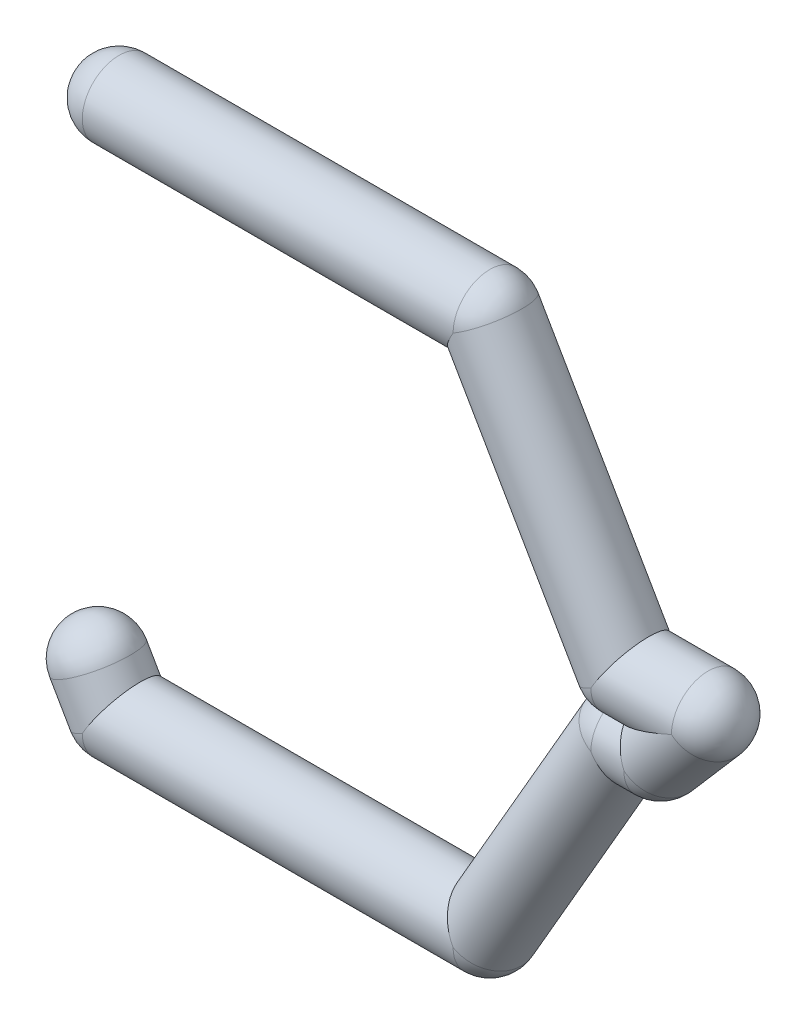
ISO-10303-21;
HEADER;
FILE_DESCRIPTION(('STEP AP214'),'2;1');
FILE_NAME('part.step','',(''),(''),'','','');
FILE_SCHEMA(('AUTOMOTIVE_DESIGN { 1 0 10303 214 1 1 1 1 }'));
ENDSEC;
DATA;
#1=APPLICATION_CONTEXT('core data for automotive mechanical design processes');
#2=APPLICATION_PROTOCOL_DEFINITION('international standard','automotive_design',2000,#1);
#3=PRODUCT_CONTEXT('',#1,'mechanical');
#4=PRODUCT('Part','Part','',(#3));
#5=PRODUCT_RELATED_PRODUCT_CATEGORY('part','',(#4));
#6=PRODUCT_DEFINITION_FORMATION('','',#4);
#7=PRODUCT_DEFINITION_CONTEXT('part definition',#1,'design');
#8=PRODUCT_DEFINITION('design','',#6,#7);
#9=PRODUCT_DEFINITION_SHAPE('','',#8);
#10=(LENGTH_UNIT() NAMED_UNIT(*) SI_UNIT(.MILLI.,.METRE.));
#11=(NAMED_UNIT(*) PLANE_ANGLE_UNIT() SI_UNIT($,.RADIAN.));
#12=(NAMED_UNIT(*) SI_UNIT($,.STERADIAN.) SOLID_ANGLE_UNIT());
#13=UNCERTAINTY_MEASURE_WITH_UNIT(LENGTH_MEASURE(1.E-05),#10,'distance_accuracy_value','');
#14=(GEOMETRIC_REPRESENTATION_CONTEXT(3) GLOBAL_UNCERTAINTY_ASSIGNED_CONTEXT((#13)) GLOBAL_UNIT_ASSIGNED_CONTEXT((#10,
#11,#12)) REPRESENTATION_CONTEXT('',''));
#15=CARTESIAN_POINT('',(0.,0.,0.));
#16=DIRECTION('',(0.,0.,1.));
#17=DIRECTION('',(1.,0.,0.));
#18=AXIS2_PLACEMENT_3D('',#15,#16,#17);
#19=CARTESIAN_POINT('',(-14.515,-13.08,1.425));
#20=DIRECTION('',(1.,0.,0.));
#21=DIRECTION('',(0.,-1.,0.));
#22=AXIS2_PLACEMENT_3D('',#19,#20,#21);
#23=SPHERICAL_SURFACE('',#22,0.24);
#24=CARTESIAN_POINT('',(-14.515,-13.08,1.425));
#25=DIRECTION('',(-0.500460168825931,0.865759562129533,0.));
#26=DIRECTION('',(-0.865759562129533,-0.500460168825931,0.));
#27=AXIS2_PLACEMENT_3D('',#24,#25,#26);
#28=CIRCLE('',#27,0.239999999999999);
#29=CARTESIAN_POINT('',(-14.515,-13.08,1.185));
#30=VERTEX_POINT('',#29);
#31=CARTESIAN_POINT('',(-14.515,-13.08,1.665));
#32=VERTEX_POINT('',#31);
#33=EDGE_CURVE('E150',#30,#32,#28,.T.);
#34=ORIENTED_EDGE('',*,*,#33,.F.);
#35=CARTESIAN_POINT('',(-14.515,-13.08,1.425));
#36=DIRECTION('',(-1.,0.,0.));
#37=DIRECTION('',(0.,0.,1.));
#38=AXIS2_PLACEMENT_3D('',#35,#36,#37);
#39=CIRCLE('',#38,0.24);
#40=EDGE_CURVE('E151',#32,#30,#39,.F.);
#41=ORIENTED_EDGE('',*,*,#40,.F.);
#42=EDGE_LOOP('',(#34,#41));
#43=FACE_BOUND('',#42,.T.);
#44=ADVANCED_FACE('F81',(#43),#23,.T.);
#45=CARTESIAN_POINT('',(-12.09,-13.08,1.425));
#46=DIRECTION('',(-1.,0.,0.));
#47=DIRECTION('',(0.,0.,1.));
#48=AXIS2_PLACEMENT_3D('',#45,#46,#47);
#49=CYLINDRICAL_SURFACE('',#48,0.24);
#50=CARTESIAN_POINT('',(-14.515,-13.08,1.425));
#51=DIRECTION('',(-0.86615823289568,0.499769862623822,0.));
#52=DIRECTION('',(-0.499769862623821,-0.86615823289568,0.));
#53=AXIS2_PLACEMENT_3D('',#50,#51,#52);
#54=ELLIPSE('',#53,0.277085630413797,0.24);
#55=EDGE_CURVE('E94',#32,#30,#54,.T.);
#56=ORIENTED_EDGE('',*,*,#55,.F.);
#57=ORIENTED_EDGE('',*,*,#40,.T.);
#58=EDGE_LOOP('',(#56,#57));
#59=FACE_BOUND('',#58,.T.);
#60=CARTESIAN_POINT('',(-12.09,-13.08,1.425));
#61=DIRECTION('',(-0.866065491045954,-0.499930560397472,0.));
#62=DIRECTION('',(-0.499930560397472,0.866065491045954,0.));
#63=AXIS2_PLACEMENT_3D('',#60,#61,#62);
#64=ELLIPSE('',#63,0.277115301881097,0.24);
#65=CARTESIAN_POINT('',(-12.09,-13.08,1.185));
#66=VERTEX_POINT('',#65);
#67=CARTESIAN_POINT('',(-12.09,-13.08,1.665));
#68=VERTEX_POINT('',#67);
#69=EDGE_CURVE('E88',#66,#68,#64,.F.);
#70=ORIENTED_EDGE('',*,*,#69,.F.);
#71=CARTESIAN_POINT('',(-12.09,-13.08,1.425));
#72=DIRECTION('',(-1.,0.,0.));
#73=DIRECTION('',(0.,0.,1.));
#74=AXIS2_PLACEMENT_3D('',#71,#72,#73);
#75=CIRCLE('',#74,0.24);
#76=EDGE_CURVE('E155',#66,#68,#75,.T.);
#77=ORIENTED_EDGE('',*,*,#76,.T.);
#78=EDGE_LOOP('',(#70,#77));
#79=FACE_BOUND('',#78,.T.);
#80=ADVANCED_FACE('F154',(#59,#79),#49,.T.);
#81=CARTESIAN_POINT('',(-12.09,-13.08,1.425));
#82=DIRECTION('',(1.,0.,0.));
#83=DIRECTION('',(0.,-1.,0.));
#84=AXIS2_PLACEMENT_3D('',#81,#82,#83);
#85=SPHERICAL_SURFACE('',#84,0.24);
#86=ORIENTED_EDGE('',*,*,#76,.F.);
#87=CARTESIAN_POINT('',(-12.09,-13.08,1.425));
#88=DIRECTION('',(-0.500138869561338,-0.865945212559032,0.));
#89=DIRECTION('',(0.865945212559032,-0.500138869561338,0.));
#90=AXIS2_PLACEMENT_3D('',#87,#88,#89);
#91=CIRCLE('',#90,0.24);
#92=EDGE_CURVE('E214',#68,#66,#91,.F.);
#93=ORIENTED_EDGE('',*,*,#92,.F.);
#94=EDGE_LOOP('',(#86,#93));
#95=FACE_BOUND('',#94,.T.);
#96=ADVANCED_FACE('F224',(#95),#85,.T.);
#97=CARTESIAN_POINT('',(-11.189,-11.52,1.425));
#98=DIRECTION('',(-0.500138869561338,-0.865945212559032,0.));
#99=DIRECTION('',(0.865945212559032,-0.500138869561338,0.));
#100=AXIS2_PLACEMENT_3D('',#97,#98,#99);
#101=CYLINDRICAL_SURFACE('',#100,0.240000000000001);
#102=CARTESIAN_POINT('',(-11.189,-11.52,1.425));
#103=DIRECTION('',(-0.866065491045954,-0.499930560397472,0.));
#104=DIRECTION('',(0.499930560397472,-0.866065491045954,0.));
#105=AXIS2_PLACEMENT_3D('',#102,#103,#104);
#106=ELLIPSE('',#105,0.277115301881097,0.24);
#107=CARTESIAN_POINT('',(-11.189,-11.52,1.665));
#108=VERTEX_POINT('',#107);
#109=CARTESIAN_POINT('',(-11.189,-11.52,1.185));
#110=VERTEX_POINT('',#109);
#111=EDGE_CURVE('E217',#108,#110,#106,.F.);
#112=ORIENTED_EDGE('',*,*,#111,.F.);
#113=CARTESIAN_POINT('',(-11.189,-11.52,1.425));
#114=DIRECTION('',(-0.500138869561336,-0.865945212559033,0.));
#115=DIRECTION('',(0.865945212559033,-0.500138869561336,0.));
#116=AXIS2_PLACEMENT_3D('',#113,#114,#115);
#117=CIRCLE('',#116,0.240000000000001);
#118=EDGE_CURVE('E212',#108,#110,#117,.T.);
#119=ORIENTED_EDGE('',*,*,#118,.T.);
#120=EDGE_LOOP('',(#112,#119));
#121=FACE_BOUND('',#120,.T.);
#122=ORIENTED_EDGE('',*,*,#92,.T.);
#123=ORIENTED_EDGE('',*,*,#69,.T.);
#124=EDGE_LOOP('',(#122,#123));
#125=FACE_BOUND('',#124,.T.);
#126=ADVANCED_FACE('F222',(#121,#125),#101,.T.);
#127=CARTESIAN_POINT('',(-11.189,-11.52,1.425));
#128=DIRECTION('',(1.,0.,0.));
#129=DIRECTION('',(0.,-1.,0.));
#130=AXIS2_PLACEMENT_3D('',#127,#128,#129);
#131=SPHERICAL_SURFACE('',#130,0.24);
#132=ORIENTED_EDGE('',*,*,#118,.F.);
#133=CARTESIAN_POINT('',(-11.189,-11.52,1.425));
#134=DIRECTION('',(-1.,0.,0.));
#135=DIRECTION('',(0.,0.,1.));
#136=AXIS2_PLACEMENT_3D('',#133,#134,#135);
#137=CIRCLE('',#136,0.24);
#138=CARTESIAN_POINT('',(-11.189,-11.34,1.58374507866388));
#139=VERTEX_POINT('',#138);
#140=EDGE_CURVE('E161',#108,#139,#137,.T.);
#141=ORIENTED_EDGE('',*,*,#140,.T.);
#142=CARTESIAN_POINT('',(-11.189,-11.34,1.425));
#143=DIRECTION('',(0.,-1.,0.));
#144=DIRECTION('',(0.,0.,-1.));
#145=AXIS2_PLACEMENT_3D('',#142,#143,#144);
#146=CIRCLE('',#145,0.158745078663876);
#147=CARTESIAN_POINT('',(-11.189,-11.34,1.26625492133612));
#148=VERTEX_POINT('',#147);
#149=EDGE_CURVE('E187',#139,#148,#146,.T.);
#150=ORIENTED_EDGE('',*,*,#149,.T.);
#151=EDGE_CURVE('E164',#148,#110,#137,.T.);
#152=ORIENTED_EDGE('',*,*,#151,.T.);
#153=EDGE_LOOP('',(#132,#141,#150,#152));
#154=FACE_BOUND('',#153,.T.);
#155=ADVANCED_FACE('F238',(#154),#131,.T.);
#156=CARTESIAN_POINT('',(-10.973,-11.52,1.425));
#157=DIRECTION('',(1.,0.,0.));
#158=DIRECTION('',(0.,-1.,0.));
#159=AXIS2_PLACEMENT_3D('',#156,#157,#158);
#160=SPHERICAL_SURFACE('',#159,0.24);
#161=CARTESIAN_POINT('',(-10.973,-11.52,1.425));
#162=DIRECTION('',(-0.65372931799024,-0.756728470985475,0.));
#163=DIRECTION('',(0.756728470985475,-0.65372931799024,0.));
#164=AXIS2_PLACEMENT_3D('',#161,#162,#163);
#165=CIRCLE('',#164,0.240000000000001);
#166=CARTESIAN_POINT('',(-10.973,-11.52,1.185));
#167=VERTEX_POINT('',#166);
#168=CARTESIAN_POINT('',(-10.973,-11.52,1.665));
#169=VERTEX_POINT('',#168);
#170=EDGE_CURVE('E176',#167,#169,#165,.T.);
#171=ORIENTED_EDGE('',*,*,#170,.T.);
#172=CARTESIAN_POINT('',(-10.973,-11.52,1.425));
#173=DIRECTION('',(-1.,0.,0.));
#174=DIRECTION('',(0.,0.,1.));
#175=AXIS2_PLACEMENT_3D('',#172,#173,#174);
#176=CIRCLE('',#175,0.24);
#177=EDGE_CURVE('E158',#167,#169,#176,.T.);
#178=ORIENTED_EDGE('',*,*,#177,.F.);
#179=EDGE_LOOP('',(#171,#178));
#180=FACE_BOUND('',#179,.T.);
#181=ADVANCED_FACE('F244',(#180),#160,.T.);
#182=CARTESIAN_POINT('',(-10.662,-11.16,1.425));
#183=DIRECTION('',(1.,0.,0.));
#184=DIRECTION('',(0.,-1.,0.));
#185=AXIS2_PLACEMENT_3D('',#182,#183,#184);
#186=SPHERICAL_SURFACE('',#185,0.24);
#187=CARTESIAN_POINT('',(-10.662,-11.16,1.425));
#188=DIRECTION('',(-0.65372931799024,-0.756728470985475,0.));
#189=DIRECTION('',(0.756728470985475,-0.65372931799024,0.));
#190=AXIS2_PLACEMENT_3D('',#187,#188,#189);
#191=CIRCLE('',#190,0.240000000000001);
#192=CARTESIAN_POINT('',(-10.662,-11.16,1.185));
#193=VERTEX_POINT('',#192);
#194=CARTESIAN_POINT('',(-10.662,-11.16,1.665));
#195=VERTEX_POINT('',#194);
#196=EDGE_CURVE('E173',#193,#195,#191,.T.);
#197=ORIENTED_EDGE('',*,*,#196,.F.);
#198=CARTESIAN_POINT('',(-10.662,-11.16,1.425));
#199=DIRECTION('',(1.,0.,0.));
#200=DIRECTION('',(0.,0.,-1.));
#201=AXIS2_PLACEMENT_3D('',#198,#199,#200);
#202=CIRCLE('',#201,0.24);
#203=EDGE_CURVE('E202',#195,#193,#202,.F.);
#204=ORIENTED_EDGE('',*,*,#203,.F.);
#205=EDGE_LOOP('',(#197,#204));
#206=FACE_BOUND('',#205,.T.);
#207=ADVANCED_FACE('F240',(#206),#186,.T.);
#208=CARTESIAN_POINT('',(-11.189,-11.16,1.425));
#209=DIRECTION('',(1.,0.,0.));
#210=DIRECTION('',(0.,0.,-1.));
#211=AXIS2_PLACEMENT_3D('',#208,#209,#210);
#212=CYLINDRICAL_SURFACE('',#211,0.24);
#213=DIRECTION('',(-1.,0.,0.));
#214=VECTOR('',#213,1.);
#215=CARTESIAN_POINT('',(-11.081,-11.34,1.26625492133612));
#216=LINE('',#215,#214);
#217=CARTESIAN_POINT('',(-11.0553660337249,-11.34,1.26625492133612));
#218=VERTEX_POINT('',#217);
#219=EDGE_CURVE('E167',#148,#218,#216,.F.);
#220=ORIENTED_EDGE('',*,*,#219,.F.);
#221=CARTESIAN_POINT('',(-11.189,-11.16,1.425));
#222=DIRECTION('',(1.,0.,0.));
#223=DIRECTION('',(0.,0.,-1.));
#224=AXIS2_PLACEMENT_3D('',#221,#222,#223);
#225=CIRCLE('',#224,0.24);
#226=CARTESIAN_POINT('',(-11.189,-11.16,1.185));
#227=VERTEX_POINT('',#226);
#228=EDGE_CURVE('E199',#148,#227,#225,.T.);
#229=ORIENTED_EDGE('',*,*,#228,.T.);
#230=CARTESIAN_POINT('',(-11.189,-11.16,1.425));
#231=DIRECTION('',(0.866065491045954,-0.499930560397472,0.));
#232=DIRECTION('',(0.499930560397472,0.866065491045954,0.));
#233=AXIS2_PLACEMENT_3D('',#230,#231,#232);
#234=ELLIPSE('',#233,0.277115301881097,0.24);
#235=CARTESIAN_POINT('',(-11.189,-11.16,1.665));
#236=VERTEX_POINT('',#235);
#237=EDGE_CURVE('E205',#236,#227,#234,.F.);
#238=ORIENTED_EDGE('',*,*,#237,.F.);
#239=EDGE_CURVE('E201',#236,#139,#225,.T.);
#240=ORIENTED_EDGE('',*,*,#239,.T.);
#241=DIRECTION('',(-1.,0.,0.));
#242=VECTOR('',#241,1.);
#243=CARTESIAN_POINT('',(-11.081,-11.34,1.58374507866388));
#244=LINE('',#243,#242);
#245=CARTESIAN_POINT('',(-11.0553660337249,-11.34,1.58374507866388));
#246=VERTEX_POINT('',#245);
#247=EDGE_CURVE('E170',#246,#139,#244,.T.);
#248=ORIENTED_EDGE('',*,*,#247,.F.);
#249=CARTESIAN_POINT('',(-10.662,-11.16,1.425));
#250=DIRECTION('',(0.416095350857088,-0.909320987877832,0.));
#251=DIRECTION('',(0.909320987877832,0.416095350857088,0.));
#252=AXIS2_PLACEMENT_3D('',#249,#250,#251);
#253=ELLIPSE('',#252,0.576790871384743,0.24);
#254=EDGE_CURVE('E181',#195,#246,#253,.T.);
#255=ORIENTED_EDGE('',*,*,#254,.F.);
#256=ORIENTED_EDGE('',*,*,#203,.T.);
#257=EDGE_CURVE('E179',#218,#193,#253,.T.);
#258=ORIENTED_EDGE('',*,*,#257,.F.);
#259=EDGE_LOOP('',(#220,#229,#238,#240,#248,#255,#256,#258));
#260=FACE_BOUND('',#259,.T.);
#261=ADVANCED_FACE('F243',(#260),#212,.T.);
#262=CARTESIAN_POINT('',(-11.189,-11.16,1.425));
#263=DIRECTION('',(1.,0.,0.));
#264=DIRECTION('',(0.,-1.,0.));
#265=AXIS2_PLACEMENT_3D('',#262,#263,#264);
#266=SPHERICAL_SURFACE('',#265,0.24);
#267=ORIENTED_EDGE('',*,*,#239,.F.);
#268=CARTESIAN_POINT('',(-11.189,-11.16,1.425));
#269=DIRECTION('',(0.500138869561338,-0.865945212559032,0.));
#270=DIRECTION('',(0.865945212559032,0.500138869561338,0.));
#271=AXIS2_PLACEMENT_3D('',#268,#269,#270);
#272=CIRCLE('',#271,0.24);
#273=EDGE_CURVE('E193',#227,#236,#272,.F.);
#274=ORIENTED_EDGE('',*,*,#273,.F.);
#275=ORIENTED_EDGE('',*,*,#228,.F.);
#276=ORIENTED_EDGE('',*,*,#149,.F.);
#277=EDGE_LOOP('',(#267,#274,#275,#276));
#278=FACE_BOUND('',#277,.T.);
#279=ADVANCED_FACE('F248',(#278),#266,.T.);
#280=CARTESIAN_POINT('',(-12.09,-9.6,1.425));
#281=DIRECTION('',(0.500138869561338,-0.865945212559032,0.));
#282=DIRECTION('',(0.865945212559032,0.500138869561338,0.));
#283=AXIS2_PLACEMENT_3D('',#280,#281,#282);
#284=CYLINDRICAL_SURFACE('',#283,0.240000000000001);
#285=CARTESIAN_POINT('',(-12.09,-9.6,1.425));
#286=DIRECTION('',(0.866065491045954,-0.499930560397472,0.));
#287=DIRECTION('',(-0.499930560397472,-0.866065491045954,0.));
#288=AXIS2_PLACEMENT_3D('',#285,#286,#287);
#289=ELLIPSE('',#288,0.277115301881097,0.24);
#290=CARTESIAN_POINT('',(-12.09,-9.6,1.185));
#291=VERTEX_POINT('',#290);
#292=CARTESIAN_POINT('',(-12.09,-9.6,1.665));
#293=VERTEX_POINT('',#292);
#294=EDGE_CURVE('E196',#291,#293,#289,.F.);
#295=ORIENTED_EDGE('',*,*,#294,.F.);
#296=CARTESIAN_POINT('',(-12.09,-9.6,1.425));
#297=DIRECTION('',(0.500138869561338,-0.865945212559032,0.));
#298=DIRECTION('',(0.865945212559032,0.500138869561338,0.));
#299=AXIS2_PLACEMENT_3D('',#296,#297,#298);
#300=CIRCLE('',#299,0.240000000000001);
#301=EDGE_CURVE('E190',#291,#293,#300,.T.);
#302=ORIENTED_EDGE('',*,*,#301,.T.);
#303=EDGE_LOOP('',(#295,#302));
#304=FACE_BOUND('',#303,.T.);
#305=ORIENTED_EDGE('',*,*,#273,.T.);
#306=ORIENTED_EDGE('',*,*,#237,.T.);
#307=EDGE_LOOP('',(#305,#306));
#308=FACE_BOUND('',#307,.T.);
#309=ADVANCED_FACE('F252',(#304,#308),#284,.T.);
#310=CARTESIAN_POINT('',(-12.09,-9.6,1.425));
#311=DIRECTION('',(1.,0.,0.));
#312=DIRECTION('',(0.,-1.,0.));
#313=AXIS2_PLACEMENT_3D('',#310,#311,#312);
#314=SPHERICAL_SURFACE('',#313,0.24);
#315=ORIENTED_EDGE('',*,*,#301,.F.);
#316=CARTESIAN_POINT('',(-12.09,-9.6,1.425));
#317=DIRECTION('',(1.,0.,0.));
#318=DIRECTION('',(0.,0.,-1.));
#319=AXIS2_PLACEMENT_3D('',#316,#317,#318);
#320=CIRCLE('',#319,0.24);
#321=EDGE_CURVE('E185',#291,#293,#320,.T.);
#322=ORIENTED_EDGE('',*,*,#321,.T.);
#323=EDGE_LOOP('',(#315,#322));
#324=FACE_BOUND('',#323,.T.);
#325=ADVANCED_FACE('F256',(#324),#314,.T.);
#326=CARTESIAN_POINT('',(-14.515,-9.6,1.425));
#327=DIRECTION('',(1.,0.,0.));
#328=DIRECTION('',(0.,0.,-1.));
#329=AXIS2_PLACEMENT_3D('',#326,#327,#328);
#330=CYLINDRICAL_SURFACE('',#329,0.24);
#331=ORIENTED_EDGE('',*,*,#321,.F.);
#332=ORIENTED_EDGE('',*,*,#294,.T.);
#333=EDGE_LOOP('',(#331,#332));
#334=FACE_BOUND('',#333,.T.);
#335=CARTESIAN_POINT('',(-14.515,-9.6,1.425));
#336=DIRECTION('',(1.,0.,0.));
#337=DIRECTION('',(0.,0.,-1.));
#338=AXIS2_PLACEMENT_3D('',#335,#336,#337);
#339=CIRCLE('',#338,0.24);
#340=CARTESIAN_POINT('',(-14.515,-9.6,1.185));
#341=VERTEX_POINT('',#340);
#342=EDGE_CURVE('E182',#341,#341,#339,.T.);
#343=ORIENTED_EDGE('',*,*,#342,.T.);
#344=EDGE_LOOP('',(#343));
#345=FACE_BOUND('',#344,.T.);
#346=ADVANCED_FACE('F268',(#334,#345),#330,.T.);
#347=CARTESIAN_POINT('',(-14.515,-9.6,1.425));
#348=DIRECTION('',(1.,0.,0.));
#349=DIRECTION('',(0.,-1.,0.));
#350=AXIS2_PLACEMENT_3D('',#347,#348,#349);
#351=SPHERICAL_SURFACE('',#350,0.24);
#352=ORIENTED_EDGE('',*,*,#342,.F.);
#353=EDGE_LOOP('',(#352));
#354=FACE_BOUND('',#353,.T.);
#355=ADVANCED_FACE('F264',(#354),#351,.T.);
#356=CARTESIAN_POINT('',(-10.662,-11.16,1.425));
#357=DIRECTION('',(-0.653729317990234,-0.756728470985481,0.));
#358=DIRECTION('',(0.756728470985481,-0.653729317990234,0.));
#359=AXIS2_PLACEMENT_3D('',#356,#357,#358);
#360=CYLINDRICAL_SURFACE('',#359,0.240000000000001);
#361=CARTESIAN_POINT('',(-10.973,-11.52,1.425));
#362=DIRECTION('',(-0.909320987877832,-0.416095350857088,0.));
#363=DIRECTION('',(0.416095350857088,-0.909320987877832,0.));
#364=AXIS2_PLACEMENT_3D('',#361,#362,#363);
#365=ELLIPSE('',#364,0.263933202025954,0.24);
#366=EDGE_CURVE('E211',#169,#246,#365,.T.);
#367=ORIENTED_EDGE('',*,*,#366,.F.);
#368=ORIENTED_EDGE('',*,*,#170,.F.);
#369=EDGE_CURVE('E208',#218,#167,#365,.T.);
#370=ORIENTED_EDGE('',*,*,#369,.F.);
#371=ORIENTED_EDGE('',*,*,#257,.T.);
#372=ORIENTED_EDGE('',*,*,#196,.T.);
#373=ORIENTED_EDGE('',*,*,#254,.T.);
#374=EDGE_LOOP('',(#367,#368,#370,#371,#372,#373));
#375=FACE_BOUND('',#374,.T.);
#376=ADVANCED_FACE('F267',(#375),#360,.T.);
#377=CARTESIAN_POINT('',(-10.973,-11.52,1.425));
#378=DIRECTION('',(-1.,0.,0.));
#379=DIRECTION('',(0.,0.,1.));
#380=AXIS2_PLACEMENT_3D('',#377,#378,#379);
#381=CYLINDRICAL_SURFACE('',#380,0.24);
#382=ORIENTED_EDGE('',*,*,#140,.F.);
#383=ORIENTED_EDGE('',*,*,#111,.T.);
#384=ORIENTED_EDGE('',*,*,#151,.F.);
#385=ORIENTED_EDGE('',*,*,#219,.T.);
#386=ORIENTED_EDGE('',*,*,#369,.T.);
#387=ORIENTED_EDGE('',*,*,#177,.T.);
#388=ORIENTED_EDGE('',*,*,#366,.T.);
#389=ORIENTED_EDGE('',*,*,#247,.T.);
#390=EDGE_LOOP('',(#382,#383,#384,#385,#386,#387,#388,#389));
#391=FACE_BOUND('',#390,.T.);
#392=ADVANCED_FACE('F278',(#391),#381,.T.);
#393=CARTESIAN_POINT('',(-14.515,-13.08,1.425));
#394=DIRECTION('',(-0.500460168825933,0.865759562129532,0.));
#395=DIRECTION('',(-0.865759562129532,-0.500460168825933,0.));
#396=AXIS2_PLACEMENT_3D('',#393,#394,#395);
#397=CYLINDRICAL_SURFACE('',#396,0.239999999999999);
#398=CARTESIAN_POINT('',(-14.652,-12.843,1.425));
#399=DIRECTION('',(-0.500460168825933,0.865759562129532,0.));
#400=DIRECTION('',(-0.865759562129532,-0.500460168825933,0.));
#401=AXIS2_PLACEMENT_3D('',#398,#399,#400);
#402=CIRCLE('',#401,0.24);
#403=CARTESIAN_POINT('',(-14.8597822949111,-12.9631104405182,1.425));
#404=VERTEX_POINT('',#403);
#405=EDGE_CURVE('E12',#404,#404,#402,.F.);
#406=ORIENTED_EDGE('',*,*,#405,.T.);
#407=EDGE_LOOP('',(#406));
#408=FACE_BOUND('',#407,.T.);
#409=ORIENTED_EDGE('',*,*,#33,.T.);
#410=ORIENTED_EDGE('',*,*,#55,.T.);
#411=EDGE_LOOP('',(#409,#410));
#412=FACE_BOUND('',#411,.T.);
#413=ADVANCED_FACE('F157',(#408,#412),#397,.T.);
#414=CARTESIAN_POINT('',(-14.652,-12.843,1.425));
#415=DIRECTION('',(1.,0.,0.));
#416=DIRECTION('',(0.,-1.,0.));
#417=AXIS2_PLACEMENT_3D('',#414,#415,#416);
#418=SPHERICAL_SURFACE('',#417,0.24);
#419=CARTESIAN_POINT('',(-14.652,-12.843,1.425));
#420=DIRECTION('',(-0.500460168825933,0.865759562129532,0.));
#421=DIRECTION('',(-0.865759562129532,-0.500460168825933,0.));
#422=AXIS2_PLACEMENT_3D('',#419,#420,#421);
#423=SPHERICAL_SURFACE('',#422,0.24);
#424=ORIENTED_EDGE('',*,*,#405,.F.);
#425=EDGE_LOOP('',(#424));
#426=FACE_BOUND('',#425,.T.);
#427=ADVANCED_FACE('F232',(#426),#423,.T.);
#428=CLOSED_SHELL('',(#44,#80,#96,#126,#155,#181,#207,#261,#279,#309,#325,#346,#355,#376,#392,
#413,#427));
#429=MANIFOLD_SOLID_BREP('B2',#428);
#430=ADVANCED_BREP_SHAPE_REPRESENTATION('',(#18,#429),#14);
#431=SHAPE_DEFINITION_REPRESENTATION(#9,#430);
ENDSEC;
END-ISO-10303-21;
